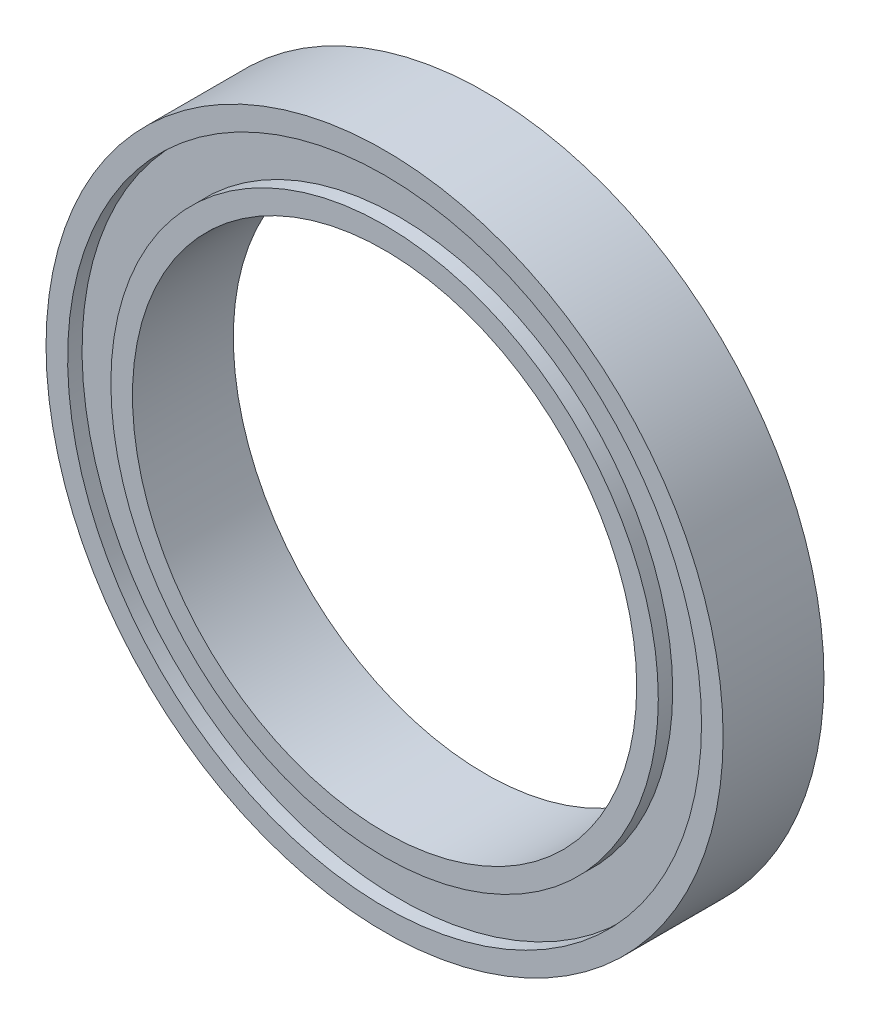
ISO-10303-21;
HEADER;
FILE_DESCRIPTION(('STEP AP214'),'2;1');
FILE_NAME('part.step','',(''),(''),'','','');
FILE_SCHEMA(('AUTOMOTIVE_DESIGN { 1 0 10303 214 1 1 1 1 }'));
ENDSEC;
DATA;
#1=APPLICATION_CONTEXT('core data for automotive mechanical design processes');
#2=APPLICATION_PROTOCOL_DEFINITION('international standard','automotive_design',2000,#1);
#3=PRODUCT_CONTEXT('',#1,'mechanical');
#4=PRODUCT('Part','Part','',(#3));
#5=PRODUCT_RELATED_PRODUCT_CATEGORY('part','',(#4));
#6=PRODUCT_DEFINITION_FORMATION('','',#4);
#7=PRODUCT_DEFINITION_CONTEXT('part definition',#1,'design');
#8=PRODUCT_DEFINITION('design','',#6,#7);
#9=PRODUCT_DEFINITION_SHAPE('','',#8);
#10=(LENGTH_UNIT() NAMED_UNIT(*) SI_UNIT(.MILLI.,.METRE.));
#11=(NAMED_UNIT(*) PLANE_ANGLE_UNIT() SI_UNIT($,.RADIAN.));
#12=(NAMED_UNIT(*) SI_UNIT($,.STERADIAN.) SOLID_ANGLE_UNIT());
#13=UNCERTAINTY_MEASURE_WITH_UNIT(LENGTH_MEASURE(1.E-05),#10,'distance_accuracy_value','');
#14=(GEOMETRIC_REPRESENTATION_CONTEXT(3) GLOBAL_UNCERTAINTY_ASSIGNED_CONTEXT((#13)) GLOBAL_UNIT_ASSIGNED_CONTEXT((#10,
#11,#12)) REPRESENTATION_CONTEXT('',''));
#15=CARTESIAN_POINT('',(0.,0.,0.));
#16=DIRECTION('',(0.,0.,1.));
#17=DIRECTION('',(1.,0.,0.));
#18=AXIS2_PLACEMENT_3D('',#15,#16,#17);
#19=CARTESIAN_POINT('',(0.,0.,7.));
#20=DIRECTION('',(0.,0.,-1.));
#21=DIRECTION('',(-1.,0.,0.));
#22=AXIS2_PLACEMENT_3D('',#19,#20,#21);
#23=CYLINDRICAL_SURFACE('',#22,22.);
#24=CARTESIAN_POINT('',(0.,0.,0.));
#25=DIRECTION('',(0.,0.,-1.));
#26=DIRECTION('',(1.,0.,0.));
#27=AXIS2_PLACEMENT_3D('',#24,#25,#26);
#28=CIRCLE('',#27,22.);
#29=CARTESIAN_POINT('',(22.,0.,0.));
#30=VERTEX_POINT('',#29);
#31=EDGE_CURVE('E63',#30,#30,#28,.T.);
#32=ORIENTED_EDGE('',*,*,#31,.T.);
#33=EDGE_LOOP('',(#32));
#34=FACE_BOUND('',#33,.T.);
#35=CARTESIAN_POINT('',(0.,0.,1.));
#36=DIRECTION('',(0.,0.,1.));
#37=DIRECTION('',(1.,0.,0.));
#38=AXIS2_PLACEMENT_3D('',#35,#36,#37);
#39=CIRCLE('',#38,22.);
#40=CARTESIAN_POINT('',(22.,0.,1.));
#41=VERTEX_POINT('',#40);
#42=EDGE_CURVE('E11',#41,#41,#39,.F.);
#43=ORIENTED_EDGE('',*,*,#42,.F.);
#44=EDGE_LOOP('',(#43));
#45=FACE_BOUND('',#44,.T.);
#46=ADVANCED_FACE('F55',(#34,#45),#23,.F.);
#47=CARTESIAN_POINT('',(0.,0.,7.));
#48=DIRECTION('',(0.,0.,-1.));
#49=DIRECTION('',(-1.,0.,0.));
#50=AXIS2_PLACEMENT_3D('',#47,#48,#49);
#51=CYLINDRICAL_SURFACE('',#50,23.5);
#52=CARTESIAN_POINT('',(0.,0.,7.));
#53=DIRECTION('',(0.,0.,1.));
#54=DIRECTION('',(1.,0.,0.));
#55=AXIS2_PLACEMENT_3D('',#52,#53,#54);
#56=CIRCLE('',#55,23.5);
#57=CARTESIAN_POINT('',(23.5,0.,7.));
#58=VERTEX_POINT('',#57);
#59=EDGE_CURVE('E68',#58,#58,#56,.T.);
#60=ORIENTED_EDGE('',*,*,#59,.F.);
#61=EDGE_LOOP('',(#60));
#62=FACE_BOUND('',#61,.T.);
#63=CARTESIAN_POINT('',(0.,0.,0.));
#64=DIRECTION('',(0.,0.,1.));
#65=DIRECTION('',(1.,0.,0.));
#66=AXIS2_PLACEMENT_3D('',#63,#64,#65);
#67=CIRCLE('',#66,23.5);
#68=CARTESIAN_POINT('',(23.5,0.,0.));
#69=VERTEX_POINT('',#68);
#70=EDGE_CURVE('E79',#69,#69,#67,.T.);
#71=ORIENTED_EDGE('',*,*,#70,.T.);
#72=EDGE_LOOP('',(#71));
#73=FACE_BOUND('',#72,.T.);
#74=ADVANCED_FACE('F137',(#62,#73),#51,.T.);
#75=CARTESIAN_POINT('',(0.,0.,7.));
#76=DIRECTION('',(0.,0.,1.));
#77=DIRECTION('',(1.,0.,0.));
#78=AXIS2_PLACEMENT_3D('',#75,#76,#77);
#79=PLANE('',#78);
#80=CARTESIAN_POINT('',(0.,0.,7.));
#81=DIRECTION('',(0.,0.,-1.));
#82=DIRECTION('',(1.,0.,0.));
#83=AXIS2_PLACEMENT_3D('',#80,#81,#82);
#84=CIRCLE('',#83,22.);
#85=CARTESIAN_POINT('',(22.,0.,7.));
#86=VERTEX_POINT('',#85);
#87=EDGE_CURVE('E74',#86,#86,#84,.T.);
#88=ORIENTED_EDGE('',*,*,#87,.T.);
#89=EDGE_LOOP('',(#88));
#90=FACE_BOUND('',#89,.T.);
#91=ORIENTED_EDGE('',*,*,#59,.T.);
#92=EDGE_LOOP('',(#91));
#93=FACE_BOUND('',#92,.T.);
#94=ADVANCED_FACE('F145',(#90,#93),#79,.T.);
#95=CARTESIAN_POINT('',(0.,0.,0.));
#96=DIRECTION('',(0.,0.,1.));
#97=DIRECTION('',(1.,0.,0.));
#98=AXIS2_PLACEMENT_3D('',#95,#96,#97);
#99=PLANE('',#98);
#100=ORIENTED_EDGE('',*,*,#31,.F.);
#101=EDGE_LOOP('',(#100));
#102=FACE_BOUND('',#101,.T.);
#103=ORIENTED_EDGE('',*,*,#70,.F.);
#104=EDGE_LOOP('',(#103));
#105=FACE_BOUND('',#104,.T.);
#106=ADVANCED_FACE('F57',(#102,#105),#99,.F.);
#107=CARTESIAN_POINT('',(0.,0.,6.));
#108=DIRECTION('',(0.,0.,1.));
#109=DIRECTION('',(0.,1.,0.));
#110=AXIS2_PLACEMENT_3D('',#107,#108,#109);
#111=CIRCLE('',#110,22.);
#112=CARTESIAN_POINT('',(0.,22.,6.));
#113=VERTEX_POINT('',#112);
#114=EDGE_CURVE('E84',#113,#113,#111,.T.);
#115=ORIENTED_EDGE('',*,*,#114,.F.);
#116=EDGE_LOOP('',(#115));
#117=FACE_BOUND('',#116,.T.);
#118=ORIENTED_EDGE('',*,*,#87,.F.);
#119=EDGE_LOOP('',(#118));
#120=FACE_BOUND('',#119,.T.);
#121=ADVANCED_FACE('F139',(#117,#120),#23,.F.);
#122=CARTESIAN_POINT('',(0.,0.,6.));
#123=DIRECTION('',(0.,0.,1.));
#124=DIRECTION('',(1.,0.,0.));
#125=AXIS2_PLACEMENT_3D('',#122,#123,#124);
#126=PLANE('',#125);
#127=ORIENTED_EDGE('',*,*,#114,.T.);
#128=EDGE_LOOP('',(#127));
#129=FACE_BOUND('',#128,.T.);
#130=CARTESIAN_POINT('',(0.,0.,6.));
#131=DIRECTION('',(0.,0.,1.));
#132=DIRECTION('',(0.,1.,0.));
#133=AXIS2_PLACEMENT_3D('',#130,#131,#132);
#134=CIRCLE('',#133,19.);
#135=CARTESIAN_POINT('',(0.,19.,6.));
#136=VERTEX_POINT('',#135);
#137=EDGE_CURVE('E89',#136,#136,#134,.T.);
#138=ORIENTED_EDGE('',*,*,#137,.F.);
#139=EDGE_LOOP('',(#138));
#140=FACE_BOUND('',#139,.T.);
#141=ADVANCED_FACE('F149',(#129,#140),#126,.T.);
#142=CARTESIAN_POINT('',(0.,0.,1.));
#143=DIRECTION('',(0.,0.,1.));
#144=DIRECTION('',(1.,0.,0.));
#145=AXIS2_PLACEMENT_3D('',#142,#143,#144);
#146=PLANE('',#145);
#147=ORIENTED_EDGE('',*,*,#42,.T.);
#148=EDGE_LOOP('',(#147));
#149=FACE_BOUND('',#148,.T.);
#150=CARTESIAN_POINT('',(0.,0.,1.));
#151=DIRECTION('',(0.,0.,1.));
#152=DIRECTION('',(1.,0.,0.));
#153=AXIS2_PLACEMENT_3D('',#150,#151,#152);
#154=CIRCLE('',#153,19.);
#155=CARTESIAN_POINT('',(19.,0.,1.));
#156=VERTEX_POINT('',#155);
#157=EDGE_CURVE('E95',#156,#156,#154,.T.);
#158=ORIENTED_EDGE('',*,*,#157,.T.);
#159=EDGE_LOOP('',(#158));
#160=FACE_BOUND('',#159,.T.);
#161=ADVANCED_FACE('F131',(#149,#160),#146,.F.);
#162=CARTESIAN_POINT('',(0.,0.,7.));
#163=DIRECTION('',(0.,0.,-1.));
#164=DIRECTION('',(-1.,0.,0.));
#165=AXIS2_PLACEMENT_3D('',#162,#163,#164);
#166=CYLINDRICAL_SURFACE('',#165,19.);
#167=CARTESIAN_POINT('',(0.,0.,0.));
#168=DIRECTION('',(0.,0.,-1.));
#169=DIRECTION('',(1.,0.,0.));
#170=AXIS2_PLACEMENT_3D('',#167,#168,#169);
#171=CIRCLE('',#170,19.);
#172=CARTESIAN_POINT('',(19.,0.,0.));
#173=VERTEX_POINT('',#172);
#174=EDGE_CURVE('E108',#173,#173,#171,.T.);
#175=ORIENTED_EDGE('',*,*,#174,.F.);
#176=EDGE_LOOP('',(#175));
#177=FACE_BOUND('',#176,.T.);
#178=ORIENTED_EDGE('',*,*,#157,.F.);
#179=EDGE_LOOP('',(#178));
#180=FACE_BOUND('',#179,.T.);
#181=ADVANCED_FACE('F121',(#177,#180),#166,.T.);
#182=CARTESIAN_POINT('',(0.,0.,7.));
#183=DIRECTION('',(0.,0.,1.));
#184=DIRECTION('',(1.,0.,0.));
#185=AXIS2_PLACEMENT_3D('',#182,#183,#184);
#186=PLANE('',#185);
#187=CARTESIAN_POINT('',(0.,0.,7.));
#188=DIRECTION('',(0.,0.,1.));
#189=DIRECTION('',(1.,0.,0.));
#190=AXIS2_PLACEMENT_3D('',#187,#188,#189);
#191=CIRCLE('',#190,17.5);
#192=CARTESIAN_POINT('',(17.5,0.,7.));
#193=VERTEX_POINT('',#192);
#194=EDGE_CURVE('E99',#193,#193,#191,.T.);
#195=ORIENTED_EDGE('',*,*,#194,.F.);
#196=EDGE_LOOP('',(#195));
#197=FACE_BOUND('',#196,.T.);
#198=CARTESIAN_POINT('',(0.,0.,7.));
#199=DIRECTION('',(0.,0.,-1.));
#200=DIRECTION('',(1.,0.,0.));
#201=AXIS2_PLACEMENT_3D('',#198,#199,#200);
#202=CIRCLE('',#201,19.);
#203=CARTESIAN_POINT('',(19.,0.,7.));
#204=VERTEX_POINT('',#203);
#205=EDGE_CURVE('E104',#204,#204,#202,.T.);
#206=ORIENTED_EDGE('',*,*,#205,.F.);
#207=EDGE_LOOP('',(#206));
#208=FACE_BOUND('',#207,.T.);
#209=ADVANCED_FACE('F118',(#197,#208),#186,.T.);
#210=CARTESIAN_POINT('',(0.,0.,7.));
#211=DIRECTION('',(0.,0.,-1.));
#212=DIRECTION('',(-1.,0.,0.));
#213=AXIS2_PLACEMENT_3D('',#210,#211,#212);
#214=CYLINDRICAL_SURFACE('',#213,17.5);
#215=ORIENTED_EDGE('',*,*,#194,.T.);
#216=EDGE_LOOP('',(#215));
#217=FACE_BOUND('',#216,.T.);
#218=CARTESIAN_POINT('',(0.,0.,0.));
#219=DIRECTION('',(0.,0.,1.));
#220=DIRECTION('',(1.,0.,0.));
#221=AXIS2_PLACEMENT_3D('',#218,#219,#220);
#222=CIRCLE('',#221,17.5);
#223=CARTESIAN_POINT('',(17.5,0.,0.));
#224=VERTEX_POINT('',#223);
#225=EDGE_CURVE('E100',#224,#224,#222,.T.);
#226=ORIENTED_EDGE('',*,*,#225,.F.);
#227=EDGE_LOOP('',(#226));
#228=FACE_BOUND('',#227,.T.);
#229=ADVANCED_FACE('F120',(#217,#228),#214,.F.);
#230=CARTESIAN_POINT('',(0.,0.,0.));
#231=DIRECTION('',(0.,0.,1.));
#232=DIRECTION('',(1.,0.,0.));
#233=AXIS2_PLACEMENT_3D('',#230,#231,#232);
#234=PLANE('',#233);
#235=ORIENTED_EDGE('',*,*,#225,.T.);
#236=EDGE_LOOP('',(#235));
#237=FACE_BOUND('',#236,.T.);
#238=ORIENTED_EDGE('',*,*,#174,.T.);
#239=EDGE_LOOP('',(#238));
#240=FACE_BOUND('',#239,.T.);
#241=ADVANCED_FACE('F128',(#237,#240),#234,.F.);
#242=ORIENTED_EDGE('',*,*,#137,.T.);
#243=EDGE_LOOP('',(#242));
#244=FACE_BOUND('',#243,.T.);
#245=ORIENTED_EDGE('',*,*,#205,.T.);
#246=EDGE_LOOP('',(#245));
#247=FACE_BOUND('',#246,.T.);
#248=ADVANCED_FACE('F116',(#244,#247),#166,.T.);
#249=CLOSED_SHELL('',(#46,#74,#94,#106,#121,#141,#161,#181,#209,#229,#241,#248));
#250=MANIFOLD_SOLID_BREP('B2',#249);
#251=ADVANCED_BREP_SHAPE_REPRESENTATION('',(#18,#250),#14);
#252=SHAPE_DEFINITION_REPRESENTATION(#9,#251);
ENDSEC;
END-ISO-10303-21;
